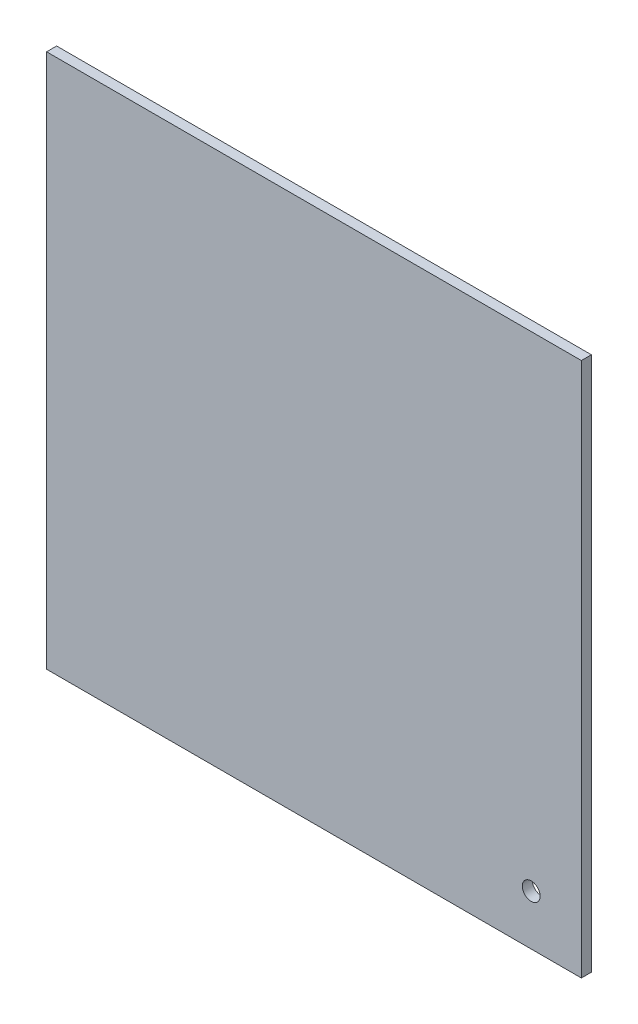
ISO-10303-21;
HEADER;
FILE_DESCRIPTION(('STEP AP214'),'2;1');
FILE_NAME('part.step','',(''),(''),'','','');
FILE_SCHEMA(('AUTOMOTIVE_DESIGN { 1 0 10303 214 1 1 1 1 }'));
ENDSEC;
DATA;
#1=APPLICATION_CONTEXT('core data for automotive mechanical design processes');
#2=APPLICATION_PROTOCOL_DEFINITION('international standard','automotive_design',2000,#1);
#3=PRODUCT_CONTEXT('',#1,'mechanical');
#4=PRODUCT('Part','Part','',(#3));
#5=PRODUCT_RELATED_PRODUCT_CATEGORY('part','',(#4));
#6=PRODUCT_DEFINITION_FORMATION('','',#4);
#7=PRODUCT_DEFINITION_CONTEXT('part definition',#1,'design');
#8=PRODUCT_DEFINITION('design','',#6,#7);
#9=PRODUCT_DEFINITION_SHAPE('','',#8);
#10=(LENGTH_UNIT() NAMED_UNIT(*) SI_UNIT(.MILLI.,.METRE.));
#11=(NAMED_UNIT(*) PLANE_ANGLE_UNIT() SI_UNIT($,.RADIAN.));
#12=(NAMED_UNIT(*) SI_UNIT($,.STERADIAN.) SOLID_ANGLE_UNIT());
#13=UNCERTAINTY_MEASURE_WITH_UNIT(LENGTH_MEASURE(1.E-05),#10,'distance_accuracy_value','');
#14=(GEOMETRIC_REPRESENTATION_CONTEXT(3) GLOBAL_UNCERTAINTY_ASSIGNED_CONTEXT((#13)) GLOBAL_UNIT_ASSIGNED_CONTEXT((#10,
#11,#12)) REPRESENTATION_CONTEXT('',''));
#15=CARTESIAN_POINT('',(0.,0.,0.));
#16=DIRECTION('',(0.,0.,1.));
#17=DIRECTION('',(1.,0.,0.));
#18=AXIS2_PLACEMENT_3D('',#15,#16,#17);
#19=CARTESIAN_POINT('',(-48.,-48.,1.8));
#20=DIRECTION('',(1.,0.,0.));
#21=DIRECTION('',(0.,0.,-1.));
#22=AXIS2_PLACEMENT_3D('',#19,#20,#21);
#23=PLANE('',#22);
#24=DIRECTION('',(0.,-1.,0.));
#25=VECTOR('',#24,1.);
#26=CARTESIAN_POINT('',(-48.,-48.,0.));
#27=LINE('',#26,#25);
#28=CARTESIAN_POINT('',(-48.,48.,0.));
#29=VERTEX_POINT('',#28);
#30=CARTESIAN_POINT('',(-48.,-48.,0.));
#31=VERTEX_POINT('',#30);
#32=EDGE_CURVE('E96',#29,#31,#27,.T.);
#33=ORIENTED_EDGE('',*,*,#32,.T.);
#34=DIRECTION('',(0.,0.,-1.));
#35=VECTOR('',#34,1.);
#36=CARTESIAN_POINT('',(-48.,-48.,1.8));
#37=LINE('',#36,#35);
#38=CARTESIAN_POINT('',(-48.,-48.,1.8));
#39=VERTEX_POINT('',#38);
#40=EDGE_CURVE('E11',#39,#31,#37,.T.);
#41=ORIENTED_EDGE('',*,*,#40,.F.);
#42=DIRECTION('',(0.,-1.,0.));
#43=VECTOR('',#42,1.);
#44=CARTESIAN_POINT('',(-48.,-48.,1.8));
#45=LINE('',#44,#43);
#46=CARTESIAN_POINT('',(-48.,48.,1.8));
#47=VERTEX_POINT('',#46);
#48=EDGE_CURVE('E84',#47,#39,#45,.T.);
#49=ORIENTED_EDGE('',*,*,#48,.F.);
#50=DIRECTION('',(0.,0.,-1.));
#51=VECTOR('',#50,1.);
#52=CARTESIAN_POINT('',(-48.,48.,1.8));
#53=LINE('',#52,#51);
#54=EDGE_CURVE('E92',#47,#29,#53,.T.);
#55=ORIENTED_EDGE('',*,*,#54,.T.);
#56=EDGE_LOOP('',(#33,#41,#49,#55));
#57=FACE_BOUND('',#56,.T.);
#58=ADVANCED_FACE('F33',(#57),#23,.F.);
#59=CARTESIAN_POINT('',(48.,-48.,1.8));
#60=DIRECTION('',(0.,1.,0.));
#61=DIRECTION('',(-1.,0.,0.));
#62=AXIS2_PLACEMENT_3D('',#59,#60,#61);
#63=PLANE('',#62);
#64=DIRECTION('',(1.,0.,0.));
#65=VECTOR('',#64,1.);
#66=CARTESIAN_POINT('',(48.,-48.,0.));
#67=LINE('',#66,#65);
#68=CARTESIAN_POINT('',(48.,-48.,0.));
#69=VERTEX_POINT('',#68);
#70=EDGE_CURVE('E88',#31,#69,#67,.T.);
#71=ORIENTED_EDGE('',*,*,#70,.T.);
#72=DIRECTION('',(0.,0.,-1.));
#73=VECTOR('',#72,1.);
#74=CARTESIAN_POINT('',(48.,-48.,1.8));
#75=LINE('',#74,#73);
#76=CARTESIAN_POINT('',(48.,-48.,1.8));
#77=VERTEX_POINT('',#76);
#78=EDGE_CURVE('E41',#77,#69,#75,.T.);
#79=ORIENTED_EDGE('',*,*,#78,.F.);
#80=DIRECTION('',(1.,0.,0.));
#81=VECTOR('',#80,1.);
#82=CARTESIAN_POINT('',(48.,-48.,1.8));
#83=LINE('',#82,#81);
#84=EDGE_CURVE('E79',#39,#77,#83,.T.);
#85=ORIENTED_EDGE('',*,*,#84,.F.);
#86=ORIENTED_EDGE('',*,*,#40,.T.);
#87=EDGE_LOOP('',(#71,#79,#85,#86));
#88=FACE_BOUND('',#87,.T.);
#89=ADVANCED_FACE('F87',(#88),#63,.F.);
#90=CARTESIAN_POINT('',(48.,-48.,1.8));
#91=DIRECTION('',(-1.,0.,0.));
#92=DIRECTION('',(0.,0.,1.));
#93=AXIS2_PLACEMENT_3D('',#90,#91,#92);
#94=PLANE('',#93);
#95=DIRECTION('',(0.,1.,0.));
#96=VECTOR('',#95,1.);
#97=CARTESIAN_POINT('',(48.,-48.,0.));
#98=LINE('',#97,#96);
#99=CARTESIAN_POINT('',(48.,48.,0.));
#100=VERTEX_POINT('',#99);
#101=EDGE_CURVE('E66',#69,#100,#98,.T.);
#102=ORIENTED_EDGE('',*,*,#101,.T.);
#103=DIRECTION('',(0.,0.,-1.));
#104=VECTOR('',#103,1.);
#105=CARTESIAN_POINT('',(48.,48.,1.8));
#106=LINE('',#105,#104);
#107=CARTESIAN_POINT('',(48.,48.,1.8));
#108=VERTEX_POINT('',#107);
#109=EDGE_CURVE('E89',#108,#100,#106,.T.);
#110=ORIENTED_EDGE('',*,*,#109,.F.);
#111=DIRECTION('',(0.,1.,0.));
#112=VECTOR('',#111,1.);
#113=CARTESIAN_POINT('',(48.,-48.,1.8));
#114=LINE('',#113,#112);
#115=EDGE_CURVE('E82',#77,#108,#114,.T.);
#116=ORIENTED_EDGE('',*,*,#115,.F.);
#117=ORIENTED_EDGE('',*,*,#78,.T.);
#118=EDGE_LOOP('',(#102,#110,#116,#117));
#119=FACE_BOUND('',#118,.T.);
#120=ADVANCED_FACE('F90',(#119),#94,.F.);
#121=CARTESIAN_POINT('',(48.,48.,1.8));
#122=DIRECTION('',(0.,-1.,0.));
#123=DIRECTION('',(1.,0.,0.));
#124=AXIS2_PLACEMENT_3D('',#121,#122,#123);
#125=PLANE('',#124);
#126=DIRECTION('',(-1.,0.,0.));
#127=VECTOR('',#126,1.);
#128=CARTESIAN_POINT('',(48.,48.,0.));
#129=LINE('',#128,#127);
#130=EDGE_CURVE('E72',#100,#29,#129,.T.);
#131=ORIENTED_EDGE('',*,*,#130,.T.);
#132=ORIENTED_EDGE('',*,*,#54,.F.);
#133=DIRECTION('',(-1.,0.,0.));
#134=VECTOR('',#133,1.);
#135=CARTESIAN_POINT('',(48.,48.,1.8));
#136=LINE('',#135,#134);
#137=EDGE_CURVE('E49',#108,#47,#136,.T.);
#138=ORIENTED_EDGE('',*,*,#137,.F.);
#139=ORIENTED_EDGE('',*,*,#109,.T.);
#140=EDGE_LOOP('',(#131,#132,#138,#139));
#141=FACE_BOUND('',#140,.T.);
#142=ADVANCED_FACE('F104',(#141),#125,.F.);
#143=CARTESIAN_POINT('',(-48.,48.,1.8));
#144=DIRECTION('',(0.,0.,1.));
#145=DIRECTION('',(1.,0.,0.));
#146=AXIS2_PLACEMENT_3D('',#143,#144,#145);
#147=PLANE('',#146);
#148=CARTESIAN_POINT('',(39.,-39.0000000000002,1.8));
#149=DIRECTION('',(0.,0.,1.));
#150=DIRECTION('',(1.,0.,0.));
#151=AXIS2_PLACEMENT_3D('',#148,#149,#150);
#152=CIRCLE('',#151,1.59999999999999);
#153=CARTESIAN_POINT('',(40.6,-39.0000000000002,1.8));
#154=VERTEX_POINT('',#153);
#155=EDGE_CURVE('E112',#154,#154,#152,.T.);
#156=ORIENTED_EDGE('',*,*,#155,.F.);
#157=EDGE_LOOP('',(#156));
#158=FACE_BOUND('',#157,.T.);
#159=ORIENTED_EDGE('',*,*,#48,.T.);
#160=ORIENTED_EDGE('',*,*,#84,.T.);
#161=ORIENTED_EDGE('',*,*,#115,.T.);
#162=ORIENTED_EDGE('',*,*,#137,.T.);
#163=EDGE_LOOP('',(#159,#160,#161,#162));
#164=FACE_BOUND('',#163,.T.);
#165=ADVANCED_FACE('F80',(#158,#164),#147,.T.);
#166=CARTESIAN_POINT('',(-48.,48.,0.));
#167=DIRECTION('',(0.,0.,1.));
#168=DIRECTION('',(1.,0.,0.));
#169=AXIS2_PLACEMENT_3D('',#166,#167,#168);
#170=PLANE('',#169);
#171=CARTESIAN_POINT('',(39.,-39.0000000000002,0.));
#172=DIRECTION('',(0.,0.,1.));
#173=DIRECTION('',(1.,0.,0.));
#174=AXIS2_PLACEMENT_3D('',#171,#172,#173);
#175=CIRCLE('',#174,1.59999999999999);
#176=CARTESIAN_POINT('',(40.6,-39.0000000000002,0.));
#177=VERTEX_POINT('',#176);
#178=EDGE_CURVE('E99',#177,#177,#175,.T.);
#179=ORIENTED_EDGE('',*,*,#178,.T.);
#180=EDGE_LOOP('',(#179));
#181=FACE_BOUND('',#180,.T.);
#182=ORIENTED_EDGE('',*,*,#32,.F.);
#183=ORIENTED_EDGE('',*,*,#130,.F.);
#184=ORIENTED_EDGE('',*,*,#101,.F.);
#185=ORIENTED_EDGE('',*,*,#70,.F.);
#186=EDGE_LOOP('',(#182,#183,#184,#185));
#187=FACE_BOUND('',#186,.T.);
#188=ADVANCED_FACE('F107',(#181,#187),#170,.F.);
#189=CARTESIAN_POINT('',(39.,-39.0000000000002,1.8));
#190=DIRECTION('',(0.,0.,1.));
#191=DIRECTION('',(1.,0.,0.));
#192=AXIS2_PLACEMENT_3D('',#189,#190,#191);
#193=CYLINDRICAL_SURFACE('',#192,1.59999999999999);
#194=ORIENTED_EDGE('',*,*,#178,.F.);
#195=EDGE_LOOP('',(#194));
#196=FACE_BOUND('',#195,.T.);
#197=ORIENTED_EDGE('',*,*,#155,.T.);
#198=EDGE_LOOP('',(#197));
#199=FACE_BOUND('',#198,.T.);
#200=ADVANCED_FACE('F116',(#196,#199),#193,.F.);
#201=CLOSED_SHELL('',(#58,#89,#120,#142,#165,#188,#200));
#202=MANIFOLD_SOLID_BREP('B2',#201);
#203=ADVANCED_BREP_SHAPE_REPRESENTATION('',(#18,#202),#14);
#204=SHAPE_DEFINITION_REPRESENTATION(#9,#203);
ENDSEC;
END-ISO-10303-21;
